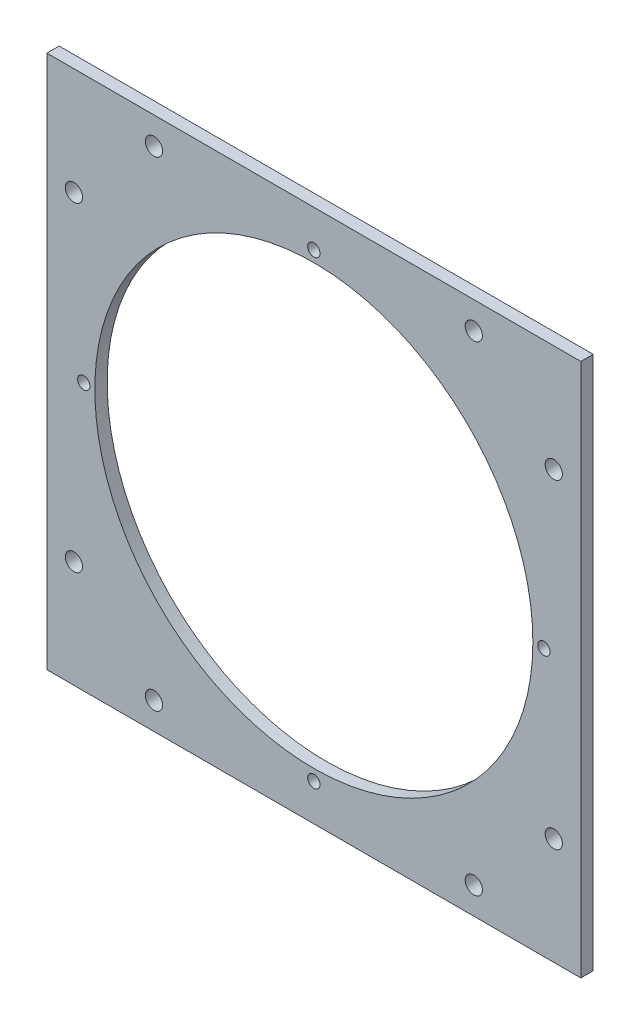
ISO-10303-21;
HEADER;
FILE_DESCRIPTION(('STEP AP214'),'2;1');
FILE_NAME('part.step','',(''),(''),'','','');
FILE_SCHEMA(('AUTOMOTIVE_DESIGN { 1 0 10303 214 1 1 1 1 }'));
ENDSEC;
DATA;
#1=APPLICATION_CONTEXT('core data for automotive mechanical design processes');
#2=APPLICATION_PROTOCOL_DEFINITION('international standard','automotive_design',2000,#1);
#3=PRODUCT_CONTEXT('',#1,'mechanical');
#4=PRODUCT('Part','Part','',(#3));
#5=PRODUCT_RELATED_PRODUCT_CATEGORY('part','',(#4));
#6=PRODUCT_DEFINITION_FORMATION('','',#4);
#7=PRODUCT_DEFINITION_CONTEXT('part definition',#1,'design');
#8=PRODUCT_DEFINITION('design','',#6,#7);
#9=PRODUCT_DEFINITION_SHAPE('','',#8);
#10=(LENGTH_UNIT() NAMED_UNIT(*) SI_UNIT(.MILLI.,.METRE.));
#11=(NAMED_UNIT(*) PLANE_ANGLE_UNIT() SI_UNIT($,.RADIAN.));
#12=(NAMED_UNIT(*) SI_UNIT($,.STERADIAN.) SOLID_ANGLE_UNIT());
#13=UNCERTAINTY_MEASURE_WITH_UNIT(LENGTH_MEASURE(1.E-05),#10,'distance_accuracy_value','');
#14=(GEOMETRIC_REPRESENTATION_CONTEXT(3) GLOBAL_UNCERTAINTY_ASSIGNED_CONTEXT((#13)) GLOBAL_UNIT_ASSIGNED_CONTEXT((#10,
#11,#12)) REPRESENTATION_CONTEXT('',''));
#15=CARTESIAN_POINT('',(0.,0.,0.));
#16=DIRECTION('',(0.,0.,1.));
#17=DIRECTION('',(1.,0.,0.));
#18=AXIS2_PLACEMENT_3D('',#15,#16,#17);
#19=CARTESIAN_POINT('',(0.,0.,5.));
#20=DIRECTION('',(0.,0.,1.));
#21=DIRECTION('',(1.,0.,0.));
#22=AXIS2_PLACEMENT_3D('',#19,#20,#21);
#23=PLANE('',#22);
#24=CARTESIAN_POINT('',(0.,93.5,5.));
#25=DIRECTION('',(0.,0.,-1.));
#26=DIRECTION('',(-1.,0.,0.));
#27=AXIS2_PLACEMENT_3D('',#24,#25,#26);
#28=CIRCLE('',#27,2.5);
#29=CARTESIAN_POINT('',(-2.5,93.5,5.));
#30=VERTEX_POINT('',#29);
#31=EDGE_CURVE('E184',#30,#30,#28,.T.);
#32=ORIENTED_EDGE('',*,*,#31,.T.);
#33=EDGE_LOOP('',(#32));
#34=FACE_BOUND('',#33,.T.);
#35=CARTESIAN_POINT('',(93.5,3.26453505181833E-13,5.));
#36=DIRECTION('',(0.,0.,-1.));
#37=DIRECTION('',(-1.,0.,0.));
#38=AXIS2_PLACEMENT_3D('',#35,#36,#37);
#39=CIRCLE('',#38,2.5);
#40=CARTESIAN_POINT('',(91.,3.26453505181833E-13,5.));
#41=VERTEX_POINT('',#40);
#42=EDGE_CURVE('E178',#41,#41,#39,.T.);
#43=ORIENTED_EDGE('',*,*,#42,.T.);
#44=EDGE_LOOP('',(#43));
#45=FACE_BOUND('',#44,.T.);
#46=CARTESIAN_POINT('',(0.,-93.5,5.));
#47=DIRECTION('',(0.,0.,-1.));
#48=DIRECTION('',(-1.,0.,0.));
#49=AXIS2_PLACEMENT_3D('',#46,#47,#48);
#50=CIRCLE('',#49,2.5);
#51=CARTESIAN_POINT('',(-2.5,-93.5,5.));
#52=VERTEX_POINT('',#51);
#53=EDGE_CURVE('E170',#52,#52,#50,.T.);
#54=ORIENTED_EDGE('',*,*,#53,.T.);
#55=EDGE_LOOP('',(#54));
#56=FACE_BOUND('',#55,.T.);
#57=CARTESIAN_POINT('',(65.,97.5,5.));
#58=DIRECTION('',(0.,0.,1.));
#59=DIRECTION('',(-1.,0.,0.));
#60=AXIS2_PLACEMENT_3D('',#57,#58,#59);
#61=CIRCLE('',#60,3.50000000000001);
#62=CARTESIAN_POINT('',(61.5,97.5,5.));
#63=VERTEX_POINT('',#62);
#64=EDGE_CURVE('E158',#63,#63,#61,.T.);
#65=ORIENTED_EDGE('',*,*,#64,.F.);
#66=EDGE_LOOP('',(#65));
#67=FACE_BOUND('',#66,.T.);
#68=CARTESIAN_POINT('',(-65.,-97.5,5.));
#69=DIRECTION('',(0.,0.,1.));
#70=DIRECTION('',(1.,0.,0.));
#71=AXIS2_PLACEMENT_3D('',#68,#69,#70);
#72=CIRCLE('',#71,3.5);
#73=CARTESIAN_POINT('',(-61.5,-97.5,5.));
#74=VERTEX_POINT('',#73);
#75=EDGE_CURVE('E146',#74,#74,#72,.T.);
#76=ORIENTED_EDGE('',*,*,#75,.F.);
#77=EDGE_LOOP('',(#76));
#78=FACE_BOUND('',#77,.T.);
#79=CARTESIAN_POINT('',(97.5,65.,5.));
#80=DIRECTION('',(0.,0.,1.));
#81=DIRECTION('',(-1.,0.,0.));
#82=AXIS2_PLACEMENT_3D('',#79,#80,#81);
#83=CIRCLE('',#82,3.50000000000001);
#84=CARTESIAN_POINT('',(94.,65.,5.));
#85=VERTEX_POINT('',#84);
#86=EDGE_CURVE('E134',#85,#85,#83,.T.);
#87=ORIENTED_EDGE('',*,*,#86,.F.);
#88=EDGE_LOOP('',(#87));
#89=FACE_BOUND('',#88,.T.);
#90=CARTESIAN_POINT('',(-97.5,-65.,5.));
#91=DIRECTION('',(0.,0.,1.));
#92=DIRECTION('',(1.,0.,0.));
#93=AXIS2_PLACEMENT_3D('',#90,#91,#92);
#94=CIRCLE('',#93,3.50000000000001);
#95=CARTESIAN_POINT('',(-94.,-65.,5.));
#96=VERTEX_POINT('',#95);
#97=EDGE_CURVE('E122',#96,#96,#94,.T.);
#98=ORIENTED_EDGE('',*,*,#97,.F.);
#99=EDGE_LOOP('',(#98));
#100=FACE_BOUND('',#99,.T.);
#101=DIRECTION('',(0.,1.,0.));
#102=VECTOR('',#101,1.);
#103=CARTESIAN_POINT('',(108.5,108.5,5.));
#104=LINE('',#103,#102);
#105=CARTESIAN_POINT('',(108.5,-108.5,5.));
#106=VERTEX_POINT('',#105);
#107=CARTESIAN_POINT('',(108.5,108.5,5.));
#108=VERTEX_POINT('',#107);
#109=EDGE_CURVE('E92',#106,#108,#104,.T.);
#110=ORIENTED_EDGE('',*,*,#109,.T.);
#111=DIRECTION('',(-1.,0.,0.));
#112=VECTOR('',#111,1.);
#113=CARTESIAN_POINT('',(-108.5,108.5,5.));
#114=LINE('',#113,#112);
#115=CARTESIAN_POINT('',(-108.5,108.5,5.));
#116=VERTEX_POINT('',#115);
#117=EDGE_CURVE('E87',#108,#116,#114,.T.);
#118=ORIENTED_EDGE('',*,*,#117,.T.);
#119=DIRECTION('',(0.,-1.,0.));
#120=VECTOR('',#119,1.);
#121=CARTESIAN_POINT('',(-108.5,108.5,5.));
#122=LINE('',#121,#120);
#123=CARTESIAN_POINT('',(-108.5,-108.5,5.));
#124=VERTEX_POINT('',#123);
#125=EDGE_CURVE('E90',#116,#124,#122,.T.);
#126=ORIENTED_EDGE('',*,*,#125,.T.);
#127=DIRECTION('',(1.,0.,0.));
#128=VECTOR('',#127,1.);
#129=CARTESIAN_POINT('',(-108.5,-108.5,5.));
#130=LINE('',#129,#128);
#131=EDGE_CURVE('E57',#124,#106,#130,.T.);
#132=ORIENTED_EDGE('',*,*,#131,.T.);
#133=EDGE_LOOP('',(#110,#118,#126,#132));
#134=FACE_BOUND('',#133,.T.);
#135=CARTESIAN_POINT('',(0.,0.,5.));
#136=DIRECTION('',(0.,0.,1.));
#137=DIRECTION('',(1.,0.,0.));
#138=AXIS2_PLACEMENT_3D('',#135,#136,#137);
#139=CIRCLE('',#138,89.);
#140=CARTESIAN_POINT('',(89.,0.,5.));
#141=VERTEX_POINT('',#140);
#142=EDGE_CURVE('E107',#141,#141,#139,.T.);
#143=ORIENTED_EDGE('',*,*,#142,.F.);
#144=EDGE_LOOP('',(#143));
#145=FACE_BOUND('',#144,.T.);
#146=CARTESIAN_POINT('',(-97.5,65.,5.));
#147=DIRECTION('',(0.,0.,1.));
#148=DIRECTION('',(1.,0.,0.));
#149=AXIS2_PLACEMENT_3D('',#146,#147,#148);
#150=CIRCLE('',#149,3.50000000000001);
#151=CARTESIAN_POINT('',(-94.,65.,5.));
#152=VERTEX_POINT('',#151);
#153=EDGE_CURVE('E128',#152,#152,#150,.T.);
#154=ORIENTED_EDGE('',*,*,#153,.F.);
#155=EDGE_LOOP('',(#154));
#156=FACE_BOUND('',#155,.T.);
#157=CARTESIAN_POINT('',(97.5,-65.,5.));
#158=DIRECTION('',(0.,0.,1.));
#159=DIRECTION('',(-1.,0.,0.));
#160=AXIS2_PLACEMENT_3D('',#157,#158,#159);
#161=CIRCLE('',#160,3.50000000000001);
#162=CARTESIAN_POINT('',(94.,-65.,5.));
#163=VERTEX_POINT('',#162);
#164=EDGE_CURVE('E140',#163,#163,#161,.T.);
#165=ORIENTED_EDGE('',*,*,#164,.F.);
#166=EDGE_LOOP('',(#165));
#167=FACE_BOUND('',#166,.T.);
#168=CARTESIAN_POINT('',(65.,-97.5,5.));
#169=DIRECTION('',(0.,0.,1.));
#170=DIRECTION('',(1.,0.,0.));
#171=AXIS2_PLACEMENT_3D('',#168,#169,#170);
#172=CIRCLE('',#171,3.50000000000001);
#173=CARTESIAN_POINT('',(68.5,-97.5,5.));
#174=VERTEX_POINT('',#173);
#175=EDGE_CURVE('E152',#174,#174,#172,.T.);
#176=ORIENTED_EDGE('',*,*,#175,.F.);
#177=EDGE_LOOP('',(#176));
#178=FACE_BOUND('',#177,.T.);
#179=CARTESIAN_POINT('',(-65.,97.5,5.));
#180=DIRECTION('',(0.,0.,1.));
#181=DIRECTION('',(-1.,0.,0.));
#182=AXIS2_PLACEMENT_3D('',#179,#180,#181);
#183=CIRCLE('',#182,3.5);
#184=CARTESIAN_POINT('',(-68.5,97.5,5.));
#185=VERTEX_POINT('',#184);
#186=EDGE_CURVE('E164',#185,#185,#183,.T.);
#187=ORIENTED_EDGE('',*,*,#186,.F.);
#188=EDGE_LOOP('',(#187));
#189=FACE_BOUND('',#188,.T.);
#190=CARTESIAN_POINT('',(-93.5,-9.79360515545499E-13,5.));
#191=DIRECTION('',(0.,0.,-1.));
#192=DIRECTION('',(-1.,0.,0.));
#193=AXIS2_PLACEMENT_3D('',#190,#191,#192);
#194=CIRCLE('',#193,2.5);
#195=CARTESIAN_POINT('',(-96.,-9.79360515545499E-13,5.));
#196=VERTEX_POINT('',#195);
#197=EDGE_CURVE('E190',#196,#196,#194,.T.);
#198=ORIENTED_EDGE('',*,*,#197,.T.);
#199=EDGE_LOOP('',(#198));
#200=FACE_BOUND('',#199,.T.);
#201=ADVANCED_FACE('F40',(#34,#45,#56,#67,#78,#89,#100,#134,#145,#156,#167,#178,#189,#200),#23,.T.);
#202=CARTESIAN_POINT('',(0.,0.,0.));
#203=DIRECTION('',(0.,0.,1.));
#204=DIRECTION('',(1.,0.,0.));
#205=AXIS2_PLACEMENT_3D('',#202,#203,#204);
#206=PLANE('',#205);
#207=CARTESIAN_POINT('',(-93.5,-9.79360515545499E-13,0.));
#208=DIRECTION('',(0.,0.,-1.));
#209=DIRECTION('',(-1.,0.,0.));
#210=AXIS2_PLACEMENT_3D('',#207,#208,#209);
#211=CIRCLE('',#210,2.49999999999999);
#212=CARTESIAN_POINT('',(-96.,-9.79360515545499E-13,0.));
#213=VERTEX_POINT('',#212);
#214=EDGE_CURVE('E193',#213,#213,#211,.T.);
#215=ORIENTED_EDGE('',*,*,#214,.F.);
#216=EDGE_LOOP('',(#215));
#217=FACE_BOUND('',#216,.T.);
#218=CARTESIAN_POINT('',(0.,-93.5,0.));
#219=DIRECTION('',(0.,0.,-1.));
#220=DIRECTION('',(-1.,0.,0.));
#221=AXIS2_PLACEMENT_3D('',#218,#219,#220);
#222=CIRCLE('',#221,2.49999999999999);
#223=CARTESIAN_POINT('',(-2.49999999999999,-93.5,0.));
#224=VERTEX_POINT('',#223);
#225=EDGE_CURVE('E175',#224,#224,#222,.T.);
#226=ORIENTED_EDGE('',*,*,#225,.F.);
#227=EDGE_LOOP('',(#226));
#228=FACE_BOUND('',#227,.T.);
#229=DIRECTION('',(0.,1.,0.));
#230=VECTOR('',#229,1.);
#231=CARTESIAN_POINT('',(108.5,108.5,0.));
#232=LINE('',#231,#230);
#233=CARTESIAN_POINT('',(108.5,-108.5,0.));
#234=VERTEX_POINT('',#233);
#235=CARTESIAN_POINT('',(108.5,108.5,0.));
#236=VERTEX_POINT('',#235);
#237=EDGE_CURVE('E104',#234,#236,#232,.T.);
#238=ORIENTED_EDGE('',*,*,#237,.F.);
#239=DIRECTION('',(1.,0.,0.));
#240=VECTOR('',#239,1.);
#241=CARTESIAN_POINT('',(-108.5,-108.5,0.));
#242=LINE('',#241,#240);
#243=CARTESIAN_POINT('',(-108.5,-108.5,0.));
#244=VERTEX_POINT('',#243);
#245=EDGE_CURVE('E80',#244,#234,#242,.T.);
#246=ORIENTED_EDGE('',*,*,#245,.F.);
#247=DIRECTION('',(0.,-1.,0.));
#248=VECTOR('',#247,1.);
#249=CARTESIAN_POINT('',(-108.5,108.5,0.));
#250=LINE('',#249,#248);
#251=CARTESIAN_POINT('',(-108.5,108.5,0.));
#252=VERTEX_POINT('',#251);
#253=EDGE_CURVE('E74',#252,#244,#250,.T.);
#254=ORIENTED_EDGE('',*,*,#253,.F.);
#255=DIRECTION('',(-1.,0.,0.));
#256=VECTOR('',#255,1.);
#257=CARTESIAN_POINT('',(-108.5,108.5,0.));
#258=LINE('',#257,#256);
#259=EDGE_CURVE('E96',#236,#252,#258,.T.);
#260=ORIENTED_EDGE('',*,*,#259,.F.);
#261=EDGE_LOOP('',(#238,#246,#254,#260));
#262=FACE_BOUND('',#261,.T.);
#263=CARTESIAN_POINT('',(0.,0.,0.));
#264=DIRECTION('',(0.,0.,1.));
#265=DIRECTION('',(1.,0.,0.));
#266=AXIS2_PLACEMENT_3D('',#263,#264,#265);
#267=CIRCLE('',#266,89.);
#268=CARTESIAN_POINT('',(89.,0.,0.));
#269=VERTEX_POINT('',#268);
#270=EDGE_CURVE('E119',#269,#269,#267,.T.);
#271=ORIENTED_EDGE('',*,*,#270,.T.);
#272=EDGE_LOOP('',(#271));
#273=FACE_BOUND('',#272,.T.);
#274=CARTESIAN_POINT('',(-97.5,-65.,0.));
#275=DIRECTION('',(0.,0.,1.));
#276=DIRECTION('',(1.,0.,0.));
#277=AXIS2_PLACEMENT_3D('',#274,#275,#276);
#278=CIRCLE('',#277,3.50000000000001);
#279=CARTESIAN_POINT('',(-94.,-65.,0.));
#280=VERTEX_POINT('',#279);
#281=EDGE_CURVE('E125',#280,#280,#278,.T.);
#282=ORIENTED_EDGE('',*,*,#281,.T.);
#283=EDGE_LOOP('',(#282));
#284=FACE_BOUND('',#283,.T.);
#285=CARTESIAN_POINT('',(-97.5,65.,0.));
#286=DIRECTION('',(0.,0.,1.));
#287=DIRECTION('',(1.,0.,0.));
#288=AXIS2_PLACEMENT_3D('',#285,#286,#287);
#289=CIRCLE('',#288,3.50000000000001);
#290=CARTESIAN_POINT('',(-94.,65.,0.));
#291=VERTEX_POINT('',#290);
#292=EDGE_CURVE('E131',#291,#291,#289,.T.);
#293=ORIENTED_EDGE('',*,*,#292,.T.);
#294=EDGE_LOOP('',(#293));
#295=FACE_BOUND('',#294,.T.);
#296=CARTESIAN_POINT('',(97.5,65.,0.));
#297=DIRECTION('',(0.,0.,1.));
#298=DIRECTION('',(-1.,0.,0.));
#299=AXIS2_PLACEMENT_3D('',#296,#297,#298);
#300=CIRCLE('',#299,3.50000000000001);
#301=CARTESIAN_POINT('',(94.,65.,0.));
#302=VERTEX_POINT('',#301);
#303=EDGE_CURVE('E137',#302,#302,#300,.T.);
#304=ORIENTED_EDGE('',*,*,#303,.T.);
#305=EDGE_LOOP('',(#304));
#306=FACE_BOUND('',#305,.T.);
#307=CARTESIAN_POINT('',(97.5,-65.,0.));
#308=DIRECTION('',(0.,0.,1.));
#309=DIRECTION('',(-1.,0.,0.));
#310=AXIS2_PLACEMENT_3D('',#307,#308,#309);
#311=CIRCLE('',#310,3.50000000000001);
#312=CARTESIAN_POINT('',(94.,-65.,0.));
#313=VERTEX_POINT('',#312);
#314=EDGE_CURVE('E143',#313,#313,#311,.T.);
#315=ORIENTED_EDGE('',*,*,#314,.T.);
#316=EDGE_LOOP('',(#315));
#317=FACE_BOUND('',#316,.T.);
#318=CARTESIAN_POINT('',(-65.,-97.5,0.));
#319=DIRECTION('',(0.,0.,1.));
#320=DIRECTION('',(1.,0.,0.));
#321=AXIS2_PLACEMENT_3D('',#318,#319,#320);
#322=CIRCLE('',#321,3.5);
#323=CARTESIAN_POINT('',(-61.5,-97.5,0.));
#324=VERTEX_POINT('',#323);
#325=EDGE_CURVE('E149',#324,#324,#322,.T.);
#326=ORIENTED_EDGE('',*,*,#325,.T.);
#327=EDGE_LOOP('',(#326));
#328=FACE_BOUND('',#327,.T.);
#329=CARTESIAN_POINT('',(65.,-97.5,0.));
#330=DIRECTION('',(0.,0.,1.));
#331=DIRECTION('',(1.,0.,0.));
#332=AXIS2_PLACEMENT_3D('',#329,#330,#331);
#333=CIRCLE('',#332,3.50000000000001);
#334=CARTESIAN_POINT('',(68.5,-97.5,0.));
#335=VERTEX_POINT('',#334);
#336=EDGE_CURVE('E155',#335,#335,#333,.T.);
#337=ORIENTED_EDGE('',*,*,#336,.T.);
#338=EDGE_LOOP('',(#337));
#339=FACE_BOUND('',#338,.T.);
#340=CARTESIAN_POINT('',(65.,97.5,0.));
#341=DIRECTION('',(0.,0.,1.));
#342=DIRECTION('',(-1.,0.,0.));
#343=AXIS2_PLACEMENT_3D('',#340,#341,#342);
#344=CIRCLE('',#343,3.50000000000001);
#345=CARTESIAN_POINT('',(61.5,97.5,0.));
#346=VERTEX_POINT('',#345);
#347=EDGE_CURVE('E161',#346,#346,#344,.T.);
#348=ORIENTED_EDGE('',*,*,#347,.T.);
#349=EDGE_LOOP('',(#348));
#350=FACE_BOUND('',#349,.T.);
#351=CARTESIAN_POINT('',(-65.,97.5,0.));
#352=DIRECTION('',(0.,0.,1.));
#353=DIRECTION('',(-1.,0.,0.));
#354=AXIS2_PLACEMENT_3D('',#351,#352,#353);
#355=CIRCLE('',#354,3.5);
#356=CARTESIAN_POINT('',(-68.5,97.5,0.));
#357=VERTEX_POINT('',#356);
#358=EDGE_CURVE('E167',#357,#357,#355,.T.);
#359=ORIENTED_EDGE('',*,*,#358,.T.);
#360=EDGE_LOOP('',(#359));
#361=FACE_BOUND('',#360,.T.);
#362=CARTESIAN_POINT('',(93.5,3.26453505181833E-13,0.));
#363=DIRECTION('',(0.,0.,-1.));
#364=DIRECTION('',(-1.,0.,0.));
#365=AXIS2_PLACEMENT_3D('',#362,#363,#364);
#366=CIRCLE('',#365,2.49999999999999);
#367=CARTESIAN_POINT('',(91.,3.26453505181833E-13,0.));
#368=VERTEX_POINT('',#367);
#369=EDGE_CURVE('E181',#368,#368,#366,.T.);
#370=ORIENTED_EDGE('',*,*,#369,.F.);
#371=EDGE_LOOP('',(#370));
#372=FACE_BOUND('',#371,.T.);
#373=CARTESIAN_POINT('',(0.,93.5,0.));
#374=DIRECTION('',(0.,0.,-1.));
#375=DIRECTION('',(-1.,0.,0.));
#376=AXIS2_PLACEMENT_3D('',#373,#374,#375);
#377=CIRCLE('',#376,2.49999999999999);
#378=CARTESIAN_POINT('',(-2.49999999999999,93.5,0.));
#379=VERTEX_POINT('',#378);
#380=EDGE_CURVE('E187',#379,#379,#377,.T.);
#381=ORIENTED_EDGE('',*,*,#380,.F.);
#382=EDGE_LOOP('',(#381));
#383=FACE_BOUND('',#382,.T.);
#384=ADVANCED_FACE('F115',(#217,#228,#262,#273,#284,#295,#306,#317,#328,#339,#350,#361,#372,
#383),#206,.F.);
#385=CARTESIAN_POINT('',(108.5,108.5,5.));
#386=DIRECTION('',(-1.,0.,0.));
#387=DIRECTION('',(0.,-1.,0.));
#388=AXIS2_PLACEMENT_3D('',#385,#386,#387);
#389=PLANE('',#388);
#390=ORIENTED_EDGE('',*,*,#237,.T.);
#391=DIRECTION('',(0.,0.,-1.));
#392=VECTOR('',#391,1.);
#393=CARTESIAN_POINT('',(108.5,108.5,5.));
#394=LINE('',#393,#392);
#395=EDGE_CURVE('E11',#108,#236,#394,.T.);
#396=ORIENTED_EDGE('',*,*,#395,.F.);
#397=ORIENTED_EDGE('',*,*,#109,.F.);
#398=DIRECTION('',(0.,0.,-1.));
#399=VECTOR('',#398,1.);
#400=CARTESIAN_POINT('',(108.5,-108.5,5.));
#401=LINE('',#400,#399);
#402=EDGE_CURVE('E100',#106,#234,#401,.T.);
#403=ORIENTED_EDGE('',*,*,#402,.T.);
#404=EDGE_LOOP('',(#390,#396,#397,#403));
#405=FACE_BOUND('',#404,.T.);
#406=ADVANCED_FACE('F42',(#405),#389,.F.);
#407=CARTESIAN_POINT('',(-108.5,108.5,5.));
#408=DIRECTION('',(0.,-1.,0.));
#409=DIRECTION('',(0.,0.,-1.));
#410=AXIS2_PLACEMENT_3D('',#407,#408,#409);
#411=PLANE('',#410);
#412=ORIENTED_EDGE('',*,*,#259,.T.);
#413=DIRECTION('',(0.,0.,-1.));
#414=VECTOR('',#413,1.);
#415=CARTESIAN_POINT('',(-108.5,108.5,5.));
#416=LINE('',#415,#414);
#417=EDGE_CURVE('E49',#116,#252,#416,.T.);
#418=ORIENTED_EDGE('',*,*,#417,.F.);
#419=ORIENTED_EDGE('',*,*,#117,.F.);
#420=ORIENTED_EDGE('',*,*,#395,.T.);
#421=EDGE_LOOP('',(#412,#418,#419,#420));
#422=FACE_BOUND('',#421,.T.);
#423=ADVANCED_FACE('F95',(#422),#411,.F.);
#424=CARTESIAN_POINT('',(-108.5,108.5,5.));
#425=DIRECTION('',(1.,0.,0.));
#426=DIRECTION('',(0.,1.,0.));
#427=AXIS2_PLACEMENT_3D('',#424,#425,#426);
#428=PLANE('',#427);
#429=ORIENTED_EDGE('',*,*,#253,.T.);
#430=DIRECTION('',(0.,0.,-1.));
#431=VECTOR('',#430,1.);
#432=CARTESIAN_POINT('',(-108.5,-108.5,5.));
#433=LINE('',#432,#431);
#434=EDGE_CURVE('E97',#124,#244,#433,.T.);
#435=ORIENTED_EDGE('',*,*,#434,.F.);
#436=ORIENTED_EDGE('',*,*,#125,.F.);
#437=ORIENTED_EDGE('',*,*,#417,.T.);
#438=EDGE_LOOP('',(#429,#435,#436,#437));
#439=FACE_BOUND('',#438,.T.);
#440=ADVANCED_FACE('F98',(#439),#428,.F.);
#441=CARTESIAN_POINT('',(-108.5,-108.5,5.));
#442=DIRECTION('',(0.,1.,0.));
#443=DIRECTION('',(0.,0.,1.));
#444=AXIS2_PLACEMENT_3D('',#441,#442,#443);
#445=PLANE('',#444);
#446=ORIENTED_EDGE('',*,*,#245,.T.);
#447=ORIENTED_EDGE('',*,*,#402,.F.);
#448=ORIENTED_EDGE('',*,*,#131,.F.);
#449=ORIENTED_EDGE('',*,*,#434,.T.);
#450=EDGE_LOOP('',(#446,#447,#448,#449));
#451=FACE_BOUND('',#450,.T.);
#452=ADVANCED_FACE('F112',(#451),#445,.F.);
#453=CARTESIAN_POINT('',(0.,0.,5.));
#454=DIRECTION('',(0.,0.,-1.));
#455=DIRECTION('',(-1.,0.,0.));
#456=AXIS2_PLACEMENT_3D('',#453,#454,#455);
#457=CYLINDRICAL_SURFACE('',#456,89.);
#458=ORIENTED_EDGE('',*,*,#142,.T.);
#459=EDGE_LOOP('',(#458));
#460=FACE_BOUND('',#459,.T.);
#461=ORIENTED_EDGE('',*,*,#270,.F.);
#462=EDGE_LOOP('',(#461));
#463=FACE_BOUND('',#462,.T.);
#464=ADVANCED_FACE('F228',(#460,#463),#457,.F.);
#465=CARTESIAN_POINT('',(-97.5,-65.,5.));
#466=DIRECTION('',(0.,0.,-1.));
#467=DIRECTION('',(-1.,0.,0.));
#468=AXIS2_PLACEMENT_3D('',#465,#466,#467);
#469=CYLINDRICAL_SURFACE('',#468,3.50000000000001);
#470=ORIENTED_EDGE('',*,*,#97,.T.);
#471=EDGE_LOOP('',(#470));
#472=FACE_BOUND('',#471,.T.);
#473=ORIENTED_EDGE('',*,*,#281,.F.);
#474=EDGE_LOOP('',(#473));
#475=FACE_BOUND('',#474,.T.);
#476=ADVANCED_FACE('F364',(#472,#475),#469,.F.);
#477=CARTESIAN_POINT('',(-97.5,65.,5.));
#478=DIRECTION('',(0.,0.,-1.));
#479=DIRECTION('',(-1.,0.,0.));
#480=AXIS2_PLACEMENT_3D('',#477,#478,#479);
#481=CYLINDRICAL_SURFACE('',#480,3.50000000000001);
#482=ORIENTED_EDGE('',*,*,#153,.T.);
#483=EDGE_LOOP('',(#482));
#484=FACE_BOUND('',#483,.T.);
#485=ORIENTED_EDGE('',*,*,#292,.F.);
#486=EDGE_LOOP('',(#485));
#487=FACE_BOUND('',#486,.T.);
#488=ADVANCED_FACE('F355',(#484,#487),#481,.F.);
#489=CARTESIAN_POINT('',(97.5,65.,5.));
#490=DIRECTION('',(0.,0.,-1.));
#491=DIRECTION('',(-1.,0.,0.));
#492=AXIS2_PLACEMENT_3D('',#489,#490,#491);
#493=CYLINDRICAL_SURFACE('',#492,3.50000000000001);
#494=ORIENTED_EDGE('',*,*,#86,.T.);
#495=EDGE_LOOP('',(#494));
#496=FACE_BOUND('',#495,.T.);
#497=ORIENTED_EDGE('',*,*,#303,.F.);
#498=EDGE_LOOP('',(#497));
#499=FACE_BOUND('',#498,.T.);
#500=ADVANCED_FACE('F346',(#496,#499),#493,.F.);
#501=CARTESIAN_POINT('',(97.5,-65.,5.));
#502=DIRECTION('',(0.,0.,-1.));
#503=DIRECTION('',(-1.,0.,0.));
#504=AXIS2_PLACEMENT_3D('',#501,#502,#503);
#505=CYLINDRICAL_SURFACE('',#504,3.50000000000001);
#506=ORIENTED_EDGE('',*,*,#164,.T.);
#507=EDGE_LOOP('',(#506));
#508=FACE_BOUND('',#507,.T.);
#509=ORIENTED_EDGE('',*,*,#314,.F.);
#510=EDGE_LOOP('',(#509));
#511=FACE_BOUND('',#510,.T.);
#512=ADVANCED_FACE('F337',(#508,#511),#505,.F.);
#513=CARTESIAN_POINT('',(-65.,-97.5,5.));
#514=DIRECTION('',(0.,0.,-1.));
#515=DIRECTION('',(-1.,0.,0.));
#516=AXIS2_PLACEMENT_3D('',#513,#514,#515);
#517=CYLINDRICAL_SURFACE('',#516,3.5);
#518=ORIENTED_EDGE('',*,*,#75,.T.);
#519=EDGE_LOOP('',(#518));
#520=FACE_BOUND('',#519,.T.);
#521=ORIENTED_EDGE('',*,*,#325,.F.);
#522=EDGE_LOOP('',(#521));
#523=FACE_BOUND('',#522,.T.);
#524=ADVANCED_FACE('F328',(#520,#523),#517,.F.);
#525=CARTESIAN_POINT('',(65.,-97.5,5.));
#526=DIRECTION('',(0.,0.,-1.));
#527=DIRECTION('',(-1.,0.,0.));
#528=AXIS2_PLACEMENT_3D('',#525,#526,#527);
#529=CYLINDRICAL_SURFACE('',#528,3.50000000000001);
#530=ORIENTED_EDGE('',*,*,#175,.T.);
#531=EDGE_LOOP('',(#530));
#532=FACE_BOUND('',#531,.T.);
#533=ORIENTED_EDGE('',*,*,#336,.F.);
#534=EDGE_LOOP('',(#533));
#535=FACE_BOUND('',#534,.T.);
#536=ADVANCED_FACE('F319',(#532,#535),#529,.F.);
#537=CARTESIAN_POINT('',(65.,97.5,5.));
#538=DIRECTION('',(0.,0.,-1.));
#539=DIRECTION('',(-1.,0.,0.));
#540=AXIS2_PLACEMENT_3D('',#537,#538,#539);
#541=CYLINDRICAL_SURFACE('',#540,3.50000000000001);
#542=ORIENTED_EDGE('',*,*,#64,.T.);
#543=EDGE_LOOP('',(#542));
#544=FACE_BOUND('',#543,.T.);
#545=ORIENTED_EDGE('',*,*,#347,.F.);
#546=EDGE_LOOP('',(#545));
#547=FACE_BOUND('',#546,.T.);
#548=ADVANCED_FACE('F217',(#544,#547),#541,.F.);
#549=CARTESIAN_POINT('',(-65.,97.5,5.));
#550=DIRECTION('',(0.,0.,-1.));
#551=DIRECTION('',(-1.,0.,0.));
#552=AXIS2_PLACEMENT_3D('',#549,#550,#551);
#553=CYLINDRICAL_SURFACE('',#552,3.5);
#554=ORIENTED_EDGE('',*,*,#186,.T.);
#555=EDGE_LOOP('',(#554));
#556=FACE_BOUND('',#555,.T.);
#557=ORIENTED_EDGE('',*,*,#358,.F.);
#558=EDGE_LOOP('',(#557));
#559=FACE_BOUND('',#558,.T.);
#560=ADVANCED_FACE('F207',(#556,#559),#553,.F.);
#561=CARTESIAN_POINT('',(0.,-93.5,0.));
#562=DIRECTION('',(0.,0.,-1.));
#563=DIRECTION('',(-1.,0.,0.));
#564=AXIS2_PLACEMENT_3D('',#561,#562,#563);
#565=CYLINDRICAL_SURFACE('',#564,2.49999999999999);
#566=ORIENTED_EDGE('',*,*,#53,.F.);
#567=EDGE_LOOP('',(#566));
#568=FACE_BOUND('',#567,.T.);
#569=ORIENTED_EDGE('',*,*,#225,.T.);
#570=EDGE_LOOP('',(#569));
#571=FACE_BOUND('',#570,.T.);
#572=ADVANCED_FACE('F204',(#568,#571),#565,.F.);
#573=CARTESIAN_POINT('',(93.5,3.26453505181833E-13,0.));
#574=DIRECTION('',(0.,0.,-1.));
#575=DIRECTION('',(-1.,0.,0.));
#576=AXIS2_PLACEMENT_3D('',#573,#574,#575);
#577=CYLINDRICAL_SURFACE('',#576,2.5);
#578=ORIENTED_EDGE('',*,*,#42,.F.);
#579=EDGE_LOOP('',(#578));
#580=FACE_BOUND('',#579,.T.);
#581=ORIENTED_EDGE('',*,*,#369,.T.);
#582=EDGE_LOOP('',(#581));
#583=FACE_BOUND('',#582,.T.);
#584=ADVANCED_FACE('F206',(#580,#583),#577,.F.);
#585=CARTESIAN_POINT('',(0.,93.5,0.));
#586=DIRECTION('',(0.,0.,-1.));
#587=DIRECTION('',(-1.,0.,0.));
#588=AXIS2_PLACEMENT_3D('',#585,#586,#587);
#589=CYLINDRICAL_SURFACE('',#588,2.49999999999999);
#590=ORIENTED_EDGE('',*,*,#31,.F.);
#591=EDGE_LOOP('',(#590));
#592=FACE_BOUND('',#591,.T.);
#593=ORIENTED_EDGE('',*,*,#380,.T.);
#594=EDGE_LOOP('',(#593));
#595=FACE_BOUND('',#594,.T.);
#596=ADVANCED_FACE('F214',(#592,#595),#589,.F.);
#597=CARTESIAN_POINT('',(-93.5,-9.79360515545499E-13,0.));
#598=DIRECTION('',(0.,0.,-1.));
#599=DIRECTION('',(-1.,0.,0.));
#600=AXIS2_PLACEMENT_3D('',#597,#598,#599);
#601=CYLINDRICAL_SURFACE('',#600,2.5);
#602=ORIENTED_EDGE('',*,*,#197,.F.);
#603=EDGE_LOOP('',(#602));
#604=FACE_BOUND('',#603,.T.);
#605=ORIENTED_EDGE('',*,*,#214,.T.);
#606=EDGE_LOOP('',(#605));
#607=FACE_BOUND('',#606,.T.);
#608=ADVANCED_FACE('F197',(#604,#607),#601,.F.);
#609=CLOSED_SHELL('',(#201,#384,#406,#423,#440,#452,#464,#476,#488,#500,#512,#524,#536,#548,
#560,#572,#584,#596,#608));
#610=MANIFOLD_SOLID_BREP('B2',#609);
#611=ADVANCED_BREP_SHAPE_REPRESENTATION('',(#18,#610),#14);
#612=SHAPE_DEFINITION_REPRESENTATION(#9,#611);
ENDSEC;
END-ISO-10303-21;
